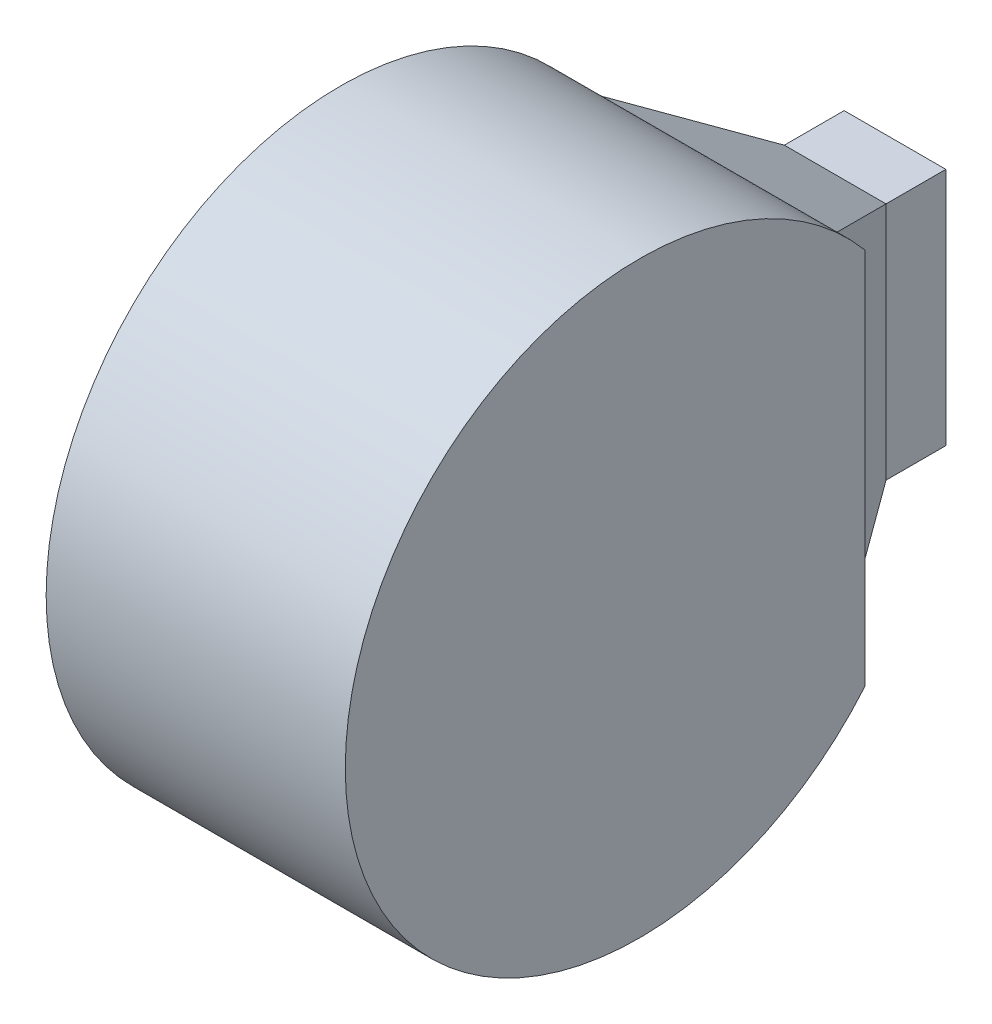
ISO-10303-21;
HEADER;
FILE_DESCRIPTION(('STEP AP214'),'2;1');
FILE_NAME('part.step','',(''),(''),'','','');
FILE_SCHEMA(('AUTOMOTIVE_DESIGN { 1 0 10303 214 1 1 1 1 }'));
ENDSEC;
DATA;
#1=APPLICATION_CONTEXT('core data for automotive mechanical design processes');
#2=APPLICATION_PROTOCOL_DEFINITION('international standard','automotive_design',2000,#1);
#3=PRODUCT_CONTEXT('',#1,'mechanical');
#4=PRODUCT('Part','Part','',(#3));
#5=PRODUCT_RELATED_PRODUCT_CATEGORY('part','',(#4));
#6=PRODUCT_DEFINITION_FORMATION('','',#4);
#7=PRODUCT_DEFINITION_CONTEXT('part definition',#1,'design');
#8=PRODUCT_DEFINITION('design','',#6,#7);
#9=PRODUCT_DEFINITION_SHAPE('','',#8);
#10=(LENGTH_UNIT() NAMED_UNIT(*) SI_UNIT(.MILLI.,.METRE.));
#11=(NAMED_UNIT(*) PLANE_ANGLE_UNIT() SI_UNIT($,.RADIAN.));
#12=(NAMED_UNIT(*) SI_UNIT($,.STERADIAN.) SOLID_ANGLE_UNIT());
#13=UNCERTAINTY_MEASURE_WITH_UNIT(LENGTH_MEASURE(1.E-05),#10,'distance_accuracy_value','');
#14=(GEOMETRIC_REPRESENTATION_CONTEXT(3) GLOBAL_UNCERTAINTY_ASSIGNED_CONTEXT((#13)) GLOBAL_UNIT_ASSIGNED_CONTEXT((#10,
#11,#12)) REPRESENTATION_CONTEXT('',''));
#15=CARTESIAN_POINT('',(0.,0.,0.));
#16=DIRECTION('',(0.,0.,1.));
#17=DIRECTION('',(1.,0.,0.));
#18=AXIS2_PLACEMENT_3D('',#15,#16,#17);
#19=CARTESIAN_POINT('',(8.5,20.,10.));
#20=DIRECTION('',(-1.,0.,0.));
#21=DIRECTION('',(0.,-1.,0.));
#22=AXIS2_PLACEMENT_3D('',#19,#20,#21);
#23=PLANE('',#22);
#24=DIRECTION('',(0.,1.,0.));
#25=VECTOR('',#24,1.);
#26=CARTESIAN_POINT('',(8.5,20.,0.));
#27=LINE('',#26,#25);
#28=CARTESIAN_POINT('',(8.5,-20.,0.));
#29=VERTEX_POINT('',#28);
#30=CARTESIAN_POINT('',(8.5,20.,0.));
#31=VERTEX_POINT('',#30);
#32=EDGE_CURVE('E149',#29,#31,#27,.T.);
#33=ORIENTED_EDGE('',*,*,#32,.T.);
#34=DIRECTION('',(0.,0.,-1.));
#35=VECTOR('',#34,1.);
#36=CARTESIAN_POINT('',(8.5,20.,10.));
#37=LINE('',#36,#35);
#38=CARTESIAN_POINT('',(8.5,20.,10.));
#39=VERTEX_POINT('',#38);
#40=EDGE_CURVE('E11',#39,#31,#37,.T.);
#41=ORIENTED_EDGE('',*,*,#40,.F.);
#42=DIRECTION('',(0.,1.,0.));
#43=VECTOR('',#42,1.);
#44=CARTESIAN_POINT('',(8.5,20.,10.));
#45=LINE('',#44,#43);
#46=CARTESIAN_POINT('',(8.5,-20.,10.));
#47=VERTEX_POINT('',#46);
#48=EDGE_CURVE('E166',#47,#39,#45,.T.);
#49=ORIENTED_EDGE('',*,*,#48,.F.);
#50=DIRECTION('',(0.,0.,-1.));
#51=VECTOR('',#50,1.);
#52=CARTESIAN_POINT('',(8.5,-20.,10.));
#53=LINE('',#52,#51);
#54=EDGE_CURVE('E176',#47,#29,#53,.T.);
#55=ORIENTED_EDGE('',*,*,#54,.T.);
#56=EDGE_LOOP('',(#33,#41,#49,#55));
#57=FACE_BOUND('',#56,.T.);
#58=ADVANCED_FACE('F43',(#57),#23,.F.);
#59=CARTESIAN_POINT('',(-8.5,20.,10.));
#60=DIRECTION('',(0.,-1.,0.));
#61=DIRECTION('',(0.,0.,-1.));
#62=AXIS2_PLACEMENT_3D('',#59,#60,#61);
#63=PLANE('',#62);
#64=DIRECTION('',(-1.,0.,0.));
#65=VECTOR('',#64,1.);
#66=CARTESIAN_POINT('',(-8.5,20.,0.));
#67=LINE('',#66,#65);
#68=CARTESIAN_POINT('',(-8.5,20.,0.));
#69=VERTEX_POINT('',#68);
#70=EDGE_CURVE('E179',#31,#69,#67,.T.);
#71=ORIENTED_EDGE('',*,*,#70,.T.);
#72=DIRECTION('',(0.,0.,-1.));
#73=VECTOR('',#72,1.);
#74=CARTESIAN_POINT('',(-8.5,20.,10.));
#75=LINE('',#74,#73);
#76=CARTESIAN_POINT('',(-8.5,20.,10.));
#77=VERTEX_POINT('',#76);
#78=EDGE_CURVE('E51',#77,#69,#75,.T.);
#79=ORIENTED_EDGE('',*,*,#78,.F.);
#80=DIRECTION('',(-1.,0.,0.));
#81=VECTOR('',#80,1.);
#82=CARTESIAN_POINT('',(-8.5,20.,10.));
#83=LINE('',#82,#81);
#84=EDGE_CURVE('E85',#39,#77,#83,.T.);
#85=ORIENTED_EDGE('',*,*,#84,.F.);
#86=ORIENTED_EDGE('',*,*,#40,.T.);
#87=EDGE_LOOP('',(#71,#79,#85,#86));
#88=FACE_BOUND('',#87,.T.);
#89=ADVANCED_FACE('F219',(#88),#63,.F.);
#90=CARTESIAN_POINT('',(-8.5,20.,10.));
#91=DIRECTION('',(1.,0.,0.));
#92=DIRECTION('',(0.,1.,0.));
#93=AXIS2_PLACEMENT_3D('',#90,#91,#92);
#94=PLANE('',#93);
#95=DIRECTION('',(0.,-1.,0.));
#96=VECTOR('',#95,1.);
#97=CARTESIAN_POINT('',(-8.5,20.,0.));
#98=LINE('',#97,#96);
#99=CARTESIAN_POINT('',(-8.5,-20.,0.));
#100=VERTEX_POINT('',#99);
#101=EDGE_CURVE('E75',#69,#100,#98,.T.);
#102=ORIENTED_EDGE('',*,*,#101,.T.);
#103=DIRECTION('',(0.,0.,-1.));
#104=VECTOR('',#103,1.);
#105=CARTESIAN_POINT('',(-8.5,-20.,10.));
#106=LINE('',#105,#104);
#107=CARTESIAN_POINT('',(-8.5,-20.,10.));
#108=VERTEX_POINT('',#107);
#109=EDGE_CURVE('E59',#108,#100,#106,.T.);
#110=ORIENTED_EDGE('',*,*,#109,.F.);
#111=DIRECTION('',(0.,-1.,0.));
#112=VECTOR('',#111,1.);
#113=CARTESIAN_POINT('',(-8.5,20.,10.));
#114=LINE('',#113,#112);
#115=EDGE_CURVE('E170',#77,#108,#114,.T.);
#116=ORIENTED_EDGE('',*,*,#115,.F.);
#117=ORIENTED_EDGE('',*,*,#78,.T.);
#118=EDGE_LOOP('',(#102,#110,#116,#117));
#119=FACE_BOUND('',#118,.T.);
#120=ADVANCED_FACE('F184',(#119),#94,.F.);
#121=CARTESIAN_POINT('',(-8.5,-20.,10.));
#122=DIRECTION('',(0.,1.,0.));
#123=DIRECTION('',(0.,0.,1.));
#124=AXIS2_PLACEMENT_3D('',#121,#122,#123);
#125=PLANE('',#124);
#126=DIRECTION('',(1.,0.,0.));
#127=VECTOR('',#126,1.);
#128=CARTESIAN_POINT('',(-8.5,-20.,0.));
#129=LINE('',#128,#127);
#130=EDGE_CURVE('E80',#100,#29,#129,.T.);
#131=ORIENTED_EDGE('',*,*,#130,.T.);
#132=ORIENTED_EDGE('',*,*,#54,.F.);
#133=DIRECTION('',(1.,0.,0.));
#134=VECTOR('',#133,1.);
#135=CARTESIAN_POINT('',(-8.5,-20.,10.));
#136=LINE('',#135,#134);
#137=EDGE_CURVE('E173',#108,#47,#136,.T.);
#138=ORIENTED_EDGE('',*,*,#137,.F.);
#139=ORIENTED_EDGE('',*,*,#109,.T.);
#140=EDGE_LOOP('',(#131,#132,#138,#139));
#141=FACE_BOUND('',#140,.T.);
#142=ADVANCED_FACE('F189',(#141),#125,.F.);
#143=CARTESIAN_POINT('',(0.,0.,0.));
#144=DIRECTION('',(0.,0.,1.));
#145=DIRECTION('',(1.,0.,0.));
#146=AXIS2_PLACEMENT_3D('',#143,#144,#145);
#147=PLANE('',#146);
#148=ORIENTED_EDGE('',*,*,#32,.F.);
#149=ORIENTED_EDGE('',*,*,#130,.F.);
#150=ORIENTED_EDGE('',*,*,#101,.F.);
#151=ORIENTED_EDGE('',*,*,#70,.F.);
#152=EDGE_LOOP('',(#148,#149,#150,#151));
#153=FACE_BOUND('',#152,.T.);
#154=ADVANCED_FACE('F187',(#153),#147,.F.);
#155=CARTESIAN_POINT('',(-8.5,-20.,10.));
#156=DIRECTION('',(0.,-0.866025403784438,-0.500000000000001));
#157=DIRECTION('',(0.,0.500000000000001,-0.866025403784438));
#158=AXIS2_PLACEMENT_3D('',#155,#156,#157);
#159=PLANE('',#158);
#160=ORIENTED_EDGE('',*,*,#137,.T.);
#161=DIRECTION('',(-0.447213595499959,0.447213595499959,-0.774596669241482));
#162=VECTOR('',#161,1.);
#163=CARTESIAN_POINT('',(8.5,-20.,10.));
#164=LINE('',#163,#162);
#165=CARTESIAN_POINT('',(20.0470053837926,-31.5470053837925,30.));
#166=VERTEX_POINT('',#165);
#167=EDGE_CURVE('E146',#166,#47,#164,.T.);
#168=ORIENTED_EDGE('',*,*,#167,.F.);
#169=DIRECTION('',(-1.,0.,0.));
#170=VECTOR('',#169,1.);
#171=CARTESIAN_POINT('',(-8.5,-31.5470053837925,30.));
#172=LINE('',#171,#170);
#173=CARTESIAN_POINT('',(-20.0470053837925,-31.5470053837925,30.));
#174=VERTEX_POINT('',#173);
#175=EDGE_CURVE('E138',#174,#166,#172,.F.);
#176=ORIENTED_EDGE('',*,*,#175,.F.);
#177=DIRECTION('',(0.447213595499959,0.447213595499959,-0.774596669241483));
#178=VECTOR('',#177,1.);
#179=CARTESIAN_POINT('',(-8.5,-20.,10.));
#180=LINE('',#179,#178);
#181=EDGE_CURVE('E151',#174,#108,#180,.T.);
#182=ORIENTED_EDGE('',*,*,#181,.T.);
#183=EDGE_LOOP('',(#160,#168,#176,#182));
#184=FACE_BOUND('',#183,.T.);
#185=ADVANCED_FACE('F194',(#184),#159,.T.);
#186=CARTESIAN_POINT('',(8.5,-20.,10.));
#187=DIRECTION('',(0.866025403784438,0.,-0.500000000000001));
#188=DIRECTION('',(-0.500000000000001,0.,-0.866025403784438));
#189=AXIS2_PLACEMENT_3D('',#186,#187,#188);
#190=PLANE('',#189);
#191=ORIENTED_EDGE('',*,*,#48,.T.);
#192=DIRECTION('',(-0.447213595499959,-0.447213595499959,-0.774596669241483));
#193=VECTOR('',#192,1.);
#194=CARTESIAN_POINT('',(8.5,20.,10.));
#195=LINE('',#194,#193);
#196=CARTESIAN_POINT('',(20.0470053837925,31.5470053837925,30.));
#197=VERTEX_POINT('',#196);
#198=EDGE_CURVE('E150',#197,#39,#195,.T.);
#199=ORIENTED_EDGE('',*,*,#198,.F.);
#200=DIRECTION('',(0.,-1.,0.));
#201=VECTOR('',#200,1.);
#202=CARTESIAN_POINT('',(20.0470053837925,-20.,30.));
#203=LINE('',#202,#201);
#204=EDGE_CURVE('E141',#166,#197,#203,.F.);
#205=ORIENTED_EDGE('',*,*,#204,.F.);
#206=ORIENTED_EDGE('',*,*,#167,.T.);
#207=EDGE_LOOP('',(#191,#199,#205,#206));
#208=FACE_BOUND('',#207,.T.);
#209=ADVANCED_FACE('F192',(#208),#190,.T.);
#210=CARTESIAN_POINT('',(8.5,20.,10.));
#211=DIRECTION('',(0.,0.866025403784438,-0.500000000000001));
#212=DIRECTION('',(0.,0.500000000000001,0.866025403784438));
#213=AXIS2_PLACEMENT_3D('',#210,#211,#212);
#214=PLANE('',#213);
#215=ORIENTED_EDGE('',*,*,#84,.T.);
#216=DIRECTION('',(0.447213595499959,-0.447213595499959,-0.774596669241482));
#217=VECTOR('',#216,1.);
#218=CARTESIAN_POINT('',(-8.5,20.,10.));
#219=LINE('',#218,#217);
#220=CARTESIAN_POINT('',(-20.0470053837926,31.5470053837925,30.));
#221=VERTEX_POINT('',#220);
#222=EDGE_CURVE('E154',#221,#77,#219,.T.);
#223=ORIENTED_EDGE('',*,*,#222,.F.);
#224=DIRECTION('',(1.,0.,0.));
#225=VECTOR('',#224,1.);
#226=CARTESIAN_POINT('',(8.5,31.5470053837925,30.));
#227=LINE('',#226,#225);
#228=EDGE_CURVE('E161',#197,#221,#227,.F.);
#229=ORIENTED_EDGE('',*,*,#228,.F.);
#230=ORIENTED_EDGE('',*,*,#198,.T.);
#231=EDGE_LOOP('',(#215,#223,#229,#230));
#232=FACE_BOUND('',#231,.T.);
#233=ADVANCED_FACE('F201',(#232),#214,.T.);
#234=CARTESIAN_POINT('',(-8.5,20.,10.));
#235=DIRECTION('',(-0.866025403784438,0.,-0.500000000000001));
#236=DIRECTION('',(-0.500000000000001,0.,0.866025403784438));
#237=AXIS2_PLACEMENT_3D('',#234,#235,#236);
#238=PLANE('',#237);
#239=ORIENTED_EDGE('',*,*,#115,.T.);
#240=ORIENTED_EDGE('',*,*,#181,.F.);
#241=DIRECTION('',(0.,1.,0.));
#242=VECTOR('',#241,1.);
#243=CARTESIAN_POINT('',(-20.0470053837925,20.,30.));
#244=LINE('',#243,#242);
#245=EDGE_CURVE('E155',#221,#174,#244,.F.);
#246=ORIENTED_EDGE('',*,*,#245,.F.);
#247=ORIENTED_EDGE('',*,*,#222,.T.);
#248=EDGE_LOOP('',(#239,#240,#246,#247));
#249=FACE_BOUND('',#248,.T.);
#250=ADVANCED_FACE('F197',(#249),#238,.T.);
#251=CARTESIAN_POINT('',(25.,31.5470053837925,30.));
#252=DIRECTION('',(0.,0.,1.));
#253=DIRECTION('',(1.,0.,0.));
#254=AXIS2_PLACEMENT_3D('',#251,#252,#253);
#255=PLANE('',#254);
#256=DIRECTION('',(-1.,0.,0.));
#257=VECTOR('',#256,1.);
#258=CARTESIAN_POINT('',(25.,-31.5470053837925,30.));
#259=LINE('',#258,#257);
#260=CARTESIAN_POINT('',(25.,-31.5470053837925,30.));
#261=VERTEX_POINT('',#260);
#262=EDGE_CURVE('E121',#261,#166,#259,.T.);
#263=ORIENTED_EDGE('',*,*,#262,.T.);
#264=ORIENTED_EDGE('',*,*,#204,.T.);
#265=DIRECTION('',(-1.,0.,0.));
#266=VECTOR('',#265,1.);
#267=CARTESIAN_POINT('',(25.,31.5470053837925,30.));
#268=LINE('',#267,#266);
#269=CARTESIAN_POINT('',(25.,31.5470053837925,30.));
#270=VERTEX_POINT('',#269);
#271=EDGE_CURVE('E123',#270,#197,#268,.T.);
#272=ORIENTED_EDGE('',*,*,#271,.F.);
#273=DIRECTION('',(0.,1.,0.));
#274=VECTOR('',#273,1.);
#275=CARTESIAN_POINT('',(25.,31.5470053837925,30.));
#276=LINE('',#275,#274);
#277=EDGE_CURVE('E116',#261,#270,#276,.T.);
#278=ORIENTED_EDGE('',*,*,#277,.F.);
#279=EDGE_LOOP('',(#263,#264,#272,#278));
#280=FACE_BOUND('',#279,.T.);
#281=ADVANCED_FACE('F118',(#280),#255,.F.);
#282=CARTESIAN_POINT('',(-25.,31.5470053837925,30.));
#283=VERTEX_POINT('',#282);
#284=EDGE_CURVE('E126',#221,#283,#268,.T.);
#285=ORIENTED_EDGE('',*,*,#284,.F.);
#286=ORIENTED_EDGE('',*,*,#245,.T.);
#287=CARTESIAN_POINT('',(-25.,-31.5470053837925,30.));
#288=VERTEX_POINT('',#287);
#289=EDGE_CURVE('E139',#174,#288,#259,.T.);
#290=ORIENTED_EDGE('',*,*,#289,.T.);
#291=DIRECTION('',(0.,1.,0.));
#292=VECTOR('',#291,1.);
#293=CARTESIAN_POINT('',(-25.,31.5470053837925,30.));
#294=LINE('',#293,#292);
#295=EDGE_CURVE('E131',#288,#283,#294,.T.);
#296=ORIENTED_EDGE('',*,*,#295,.T.);
#297=EDGE_LOOP('',(#285,#286,#290,#296));
#298=FACE_BOUND('',#297,.T.);
#299=ADVANCED_FACE('F207',(#298),#255,.F.);
#300=CARTESIAN_POINT('',(25.,0.,67.7157745558488));
#301=DIRECTION('',(-1.,0.,0.));
#302=DIRECTION('',(0.,0.,1.));
#303=AXIS2_PLACEMENT_3D('',#300,#301,#302);
#304=CYLINDRICAL_SURFACE('',#303,49.1700437159928);
#305=CARTESIAN_POINT('',(-25.,0.,67.7157745558488));
#306=DIRECTION('',(1.,0.,0.));
#307=DIRECTION('',(0.,0.,-1.));
#308=AXIS2_PLACEMENT_3D('',#305,#306,#307);
#309=CIRCLE('',#308,49.1700437159928);
#310=EDGE_CURVE('E204',#283,#288,#309,.T.);
#311=ORIENTED_EDGE('',*,*,#310,.T.);
#312=ORIENTED_EDGE('',*,*,#289,.F.);
#313=ORIENTED_EDGE('',*,*,#175,.T.);
#314=ORIENTED_EDGE('',*,*,#262,.F.);
#315=CARTESIAN_POINT('',(25.,0.,67.7157745558488));
#316=DIRECTION('',(1.,0.,0.));
#317=DIRECTION('',(0.,0.,-1.));
#318=AXIS2_PLACEMENT_3D('',#315,#316,#317);
#319=CIRCLE('',#318,49.1700437159928);
#320=EDGE_CURVE('E127',#270,#261,#319,.T.);
#321=ORIENTED_EDGE('',*,*,#320,.F.);
#322=ORIENTED_EDGE('',*,*,#271,.T.);
#323=ORIENTED_EDGE('',*,*,#228,.T.);
#324=ORIENTED_EDGE('',*,*,#284,.T.);
#325=EDGE_LOOP('',(#311,#312,#313,#314,#321,#322,#323,#324));
#326=FACE_BOUND('',#325,.T.);
#327=ADVANCED_FACE('F135',(#326),#304,.T.);
#328=CARTESIAN_POINT('',(25.,0.,67.7157745558488));
#329=DIRECTION('',(1.,0.,0.));
#330=DIRECTION('',(0.,0.,-1.));
#331=AXIS2_PLACEMENT_3D('',#328,#329,#330);
#332=PLANE('',#331);
#333=ORIENTED_EDGE('',*,*,#320,.T.);
#334=ORIENTED_EDGE('',*,*,#277,.T.);
#335=EDGE_LOOP('',(#333,#334));
#336=FACE_BOUND('',#335,.T.);
#337=ADVANCED_FACE('F129',(#336),#332,.T.);
#338=CARTESIAN_POINT('',(-25.,0.,67.7157745558488));
#339=DIRECTION('',(1.,0.,0.));
#340=DIRECTION('',(0.,0.,-1.));
#341=AXIS2_PLACEMENT_3D('',#338,#339,#340);
#342=PLANE('',#341);
#343=ORIENTED_EDGE('',*,*,#310,.F.);
#344=ORIENTED_EDGE('',*,*,#295,.F.);
#345=EDGE_LOOP('',(#343,#344));
#346=FACE_BOUND('',#345,.T.);
#347=ADVANCED_FACE('F209',(#346),#342,.F.);
#348=CLOSED_SHELL('',(#58,#89,#120,#142,#154,#185,#209,#233,#250,#281,#299,#327,#337,#347));
#349=MANIFOLD_SOLID_BREP('B2',#348);
#350=ADVANCED_BREP_SHAPE_REPRESENTATION('',(#18,#349),#14);
#351=SHAPE_DEFINITION_REPRESENTATION(#9,#350);
ENDSEC;
END-ISO-10303-21;
